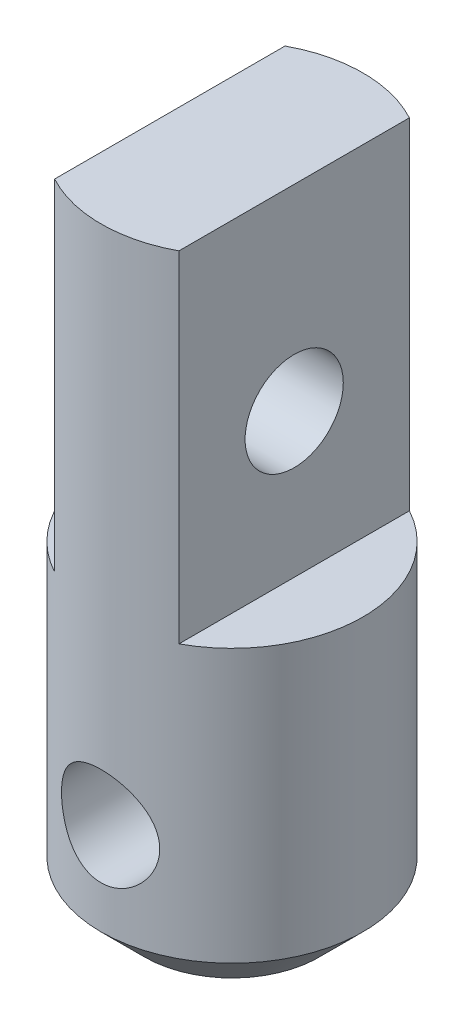
ISO-10303-21;
HEADER;
FILE_DESCRIPTION(('STEP AP214'),'2;1');
FILE_NAME('part.step','',(''),(''),'','','');
FILE_SCHEMA(('AUTOMOTIVE_DESIGN { 1 0 10303 214 1 1 1 1 }'));
ENDSEC;
DATA;
#1=APPLICATION_CONTEXT('core data for automotive mechanical design processes');
#2=APPLICATION_PROTOCOL_DEFINITION('international standard','automotive_design',2000,#1);
#3=PRODUCT_CONTEXT('',#1,'mechanical');
#4=PRODUCT('Part','Part','',(#3));
#5=PRODUCT_RELATED_PRODUCT_CATEGORY('part','',(#4));
#6=PRODUCT_DEFINITION_FORMATION('','',#4);
#7=PRODUCT_DEFINITION_CONTEXT('part definition',#1,'design');
#8=PRODUCT_DEFINITION('design','',#6,#7);
#9=PRODUCT_DEFINITION_SHAPE('','',#8);
#10=(LENGTH_UNIT() NAMED_UNIT(*) SI_UNIT(.MILLI.,.METRE.));
#11=(NAMED_UNIT(*) PLANE_ANGLE_UNIT() SI_UNIT($,.RADIAN.));
#12=(NAMED_UNIT(*) SI_UNIT($,.STERADIAN.) SOLID_ANGLE_UNIT());
#13=UNCERTAINTY_MEASURE_WITH_UNIT(LENGTH_MEASURE(1.E-05),#10,'distance_accuracy_value','');
#14=(GEOMETRIC_REPRESENTATION_CONTEXT(3) GLOBAL_UNCERTAINTY_ASSIGNED_CONTEXT((#13)) GLOBAL_UNIT_ASSIGNED_CONTEXT((#10,
#11,#12)) REPRESENTATION_CONTEXT('',''));
#15=CARTESIAN_POINT('',(0.,0.,0.));
#16=DIRECTION('',(0.,0.,1.));
#17=DIRECTION('',(1.,0.,0.));
#18=AXIS2_PLACEMENT_3D('',#15,#16,#17);
#19=CARTESIAN_POINT('',(0.,14.5,0.));
#20=DIRECTION('',(0.,1.,0.));
#21=DIRECTION('',(0.,0.,1.));
#22=AXIS2_PLACEMENT_3D('',#19,#20,#21);
#23=PLANE('',#22);
#24=CARTESIAN_POINT('',(0.,14.5,0.));
#25=DIRECTION('',(0.,1.,0.));
#26=DIRECTION('',(0.,0.,1.));
#27=AXIS2_PLACEMENT_3D('',#24,#25,#26);
#28=CIRCLE('',#27,6.);
#29=CARTESIAN_POINT('',(2.85,14.5,5.27991477203941));
#30=VERTEX_POINT('',#29);
#31=CARTESIAN_POINT('',(2.85,14.5,-5.27991477203941));
#32=VERTEX_POINT('',#31);
#33=EDGE_CURVE('E149',#30,#32,#28,.T.);
#34=ORIENTED_EDGE('',*,*,#33,.T.);
#35=DIRECTION('',(0.,0.,1.));
#36=VECTOR('',#35,1.);
#37=CARTESIAN_POINT('',(2.85,14.5,-5.27991477203941));
#38=LINE('',#37,#36);
#39=EDGE_CURVE('E116',#32,#30,#38,.T.);
#40=ORIENTED_EDGE('',*,*,#39,.T.);
#41=EDGE_LOOP('',(#34,#40));
#42=FACE_BOUND('',#41,.T.);
#43=ADVANCED_FACE('F59',(#42),#23,.T.);
#44=CARTESIAN_POINT('',(0.,14.5,0.));
#45=DIRECTION('',(0.,-1.,0.));
#46=DIRECTION('',(0.,0.,-1.));
#47=AXIS2_PLACEMENT_3D('',#44,#45,#46);
#48=CYLINDRICAL_SURFACE('',#47,6.);
#49=CARTESIAN_POINT('',(0.,8.44999999999999,-6.));
#50=CARTESIAN_POINT('',(-0.121852588406779,8.45000435345466,-6.00000326184227));
#51=CARTESIAN_POINT('',(-0.243675362672687,8.44007035962742,-5.99625568924776));
#52=CARTESIAN_POINT('',(-0.48368017852854,8.4007577070951,-5.98168044010391));
#53=CARTESIAN_POINT('',(-0.601862741981422,8.37138184929414,-5.9708537834099));
#54=CARTESIAN_POINT('',(-0.831091177486316,8.29437049734235,-5.94328248587317));
#55=CARTESIAN_POINT('',(-0.942150336243413,8.24677022476731,-5.9265492652416));
#56=CARTESIAN_POINT('',(-1.15469896524038,8.13484038047626,-5.8888315164803));
#57=CARTESIAN_POINT('',(-1.25618585876681,8.07050632168376,-5.86784584841322));
#58=CARTESIAN_POINT('',(-1.45101962556873,7.92408120339363,-5.82279370456825));
#59=CARTESIAN_POINT('',(-1.54390609522678,7.84140460661089,-5.79864003875349));
#60=CARTESIAN_POINT('',(-1.71486632211544,7.66188434801173,-5.7504033130699));
#61=CARTESIAN_POINT('',(-1.79293554538803,7.56503636586818,-5.72632027702549));
#62=CARTESIAN_POINT('',(-1.93497303323977,7.35542379871518,-5.67993705926597));
#63=CARTESIAN_POINT('',(-1.99829089793639,7.24219345018127,-5.65773973231228));
#64=CARTESIAN_POINT('',(-2.10477969501126,7.00572746874721,-5.6189979035615));
#65=CARTESIAN_POINT('',(-2.14795867441858,6.88249585526734,-5.60245114463822));
#66=CARTESIAN_POINT('',(-2.21112646526323,6.6348248896127,-5.57781619236204));
#67=CARTESIAN_POINT('',(-2.23199389827836,6.51064244234684,-5.56940886526257));
#68=CARTESIAN_POINT('',(-2.25269334797471,6.26027576300924,-5.56107092191822));
#69=CARTESIAN_POINT('',(-2.25253405203945,6.13409237918829,-5.56113680488957));
#70=CARTESIAN_POINT('',(-2.23185644415026,5.89134571218056,-5.56946267448082));
#71=CARTESIAN_POINT('',(-2.21255712763505,5.77465864093373,-5.57723203306683));
#72=CARTESIAN_POINT('',(-2.15616251802494,5.54631927439203,-5.59927407089295));
#73=CARTESIAN_POINT('',(-2.11906454494887,5.43466774007918,-5.61354772948295));
#74=CARTESIAN_POINT('',(-2.02745622857855,5.21708439840765,-5.6472855328538));
#75=CARTESIAN_POINT('',(-1.9726297310565,5.11130077081805,-5.66684276982249));
#76=CARTESIAN_POINT('',(-1.84734110644046,4.91008139361354,-5.70891315208979));
#77=CARTESIAN_POINT('',(-1.77687358093344,4.81464923372045,-5.73142731685737));
#78=CARTESIAN_POINT('',(-1.61672671149823,4.63009450452369,-5.7787205828867));
#79=CARTESIAN_POINT('',(-1.52607448075433,4.54182703887786,-5.80355021183506));
#80=CARTESIAN_POINT('',(-1.33096888622853,4.38149305069131,-5.85137592246129));
#81=CARTESIAN_POINT('',(-1.22651340524604,4.3094290180915,-5.87437172198928));
#82=CARTESIAN_POINT('',(-1.00458515548863,4.18260440440622,-5.9163959221362));
#83=CARTESIAN_POINT('',(-0.886936070767076,4.12812862816841,-5.93535747389424));
#84=CARTESIAN_POINT('',(-0.643255275786872,4.04002609359495,-5.96668077490443));
#85=CARTESIAN_POINT('',(-0.517227316268649,4.00639007515833,-5.9790454551224));
#86=CARTESIAN_POINT('',(-0.267562864722997,3.9625658186871,-5.99526664842098));
#87=CARTESIAN_POINT('',(-0.144155429343313,3.95122609042624,-5.99954053538529));
#88=CARTESIAN_POINT('',(0.102858712882537,3.94896340415013,-6.00038840550189));
#89=CARTESIAN_POINT('',(0.226465369475059,3.95803591952484,-5.99696409580295));
#90=CARTESIAN_POINT('',(0.465393072842788,3.99546506346301,-5.98307564658965));
#91=CARTESIAN_POINT('',(0.580849992011003,4.02306731560563,-5.97288706443457));
#92=CARTESIAN_POINT('',(0.80541263243583,4.09577910882099,-5.94677215637576));
#93=CARTESIAN_POINT('',(0.9145175255213,4.14089092692206,-5.93084508423045));
#94=CARTESIAN_POINT('',(1.12687164766523,4.24877961865922,-5.89424436611522));
#95=CARTESIAN_POINT('',(1.22985462533669,4.31203659383508,-5.87344500314022));
#96=CARTESIAN_POINT('',(1.42408906758993,4.45387715475734,-5.82940007346996));
#97=CARTESIAN_POINT('',(1.51533618040567,4.53246639881773,-5.80615360514274));
#98=CARTESIAN_POINT('',(1.68904619811681,4.70810618318642,-5.75809994236484));
#99=CARTESIAN_POINT('',(1.77069231185352,4.80596327415905,-5.73328044755594));
#100=CARTESIAN_POINT('',(1.91656575047854,5.01447707706149,-5.68618223620281));
#101=CARTESIAN_POINT('',(1.98079151121777,5.12513493708275,-5.66390374791599));
#102=CARTESIAN_POINT('',(2.09006660278496,5.35702398015847,-5.62450244733695));
#103=CARTESIAN_POINT('',(2.13503528170376,5.47829711886566,-5.6074014049274));
#104=CARTESIAN_POINT('',(2.20361825200333,5.72751464553173,-5.58081049336508));
#105=CARTESIAN_POINT('',(2.22724575458302,5.85545485429719,-5.57131591586236));
#106=CARTESIAN_POINT('',(2.25129520646758,6.10552423931167,-5.5616384218886));
#107=CARTESIAN_POINT('',(2.25310997243755,6.22749894757533,-5.56089666785012));
#108=CARTESIAN_POINT('',(2.23705073462388,6.46991797441425,-5.56737619117939));
#109=CARTESIAN_POINT('',(2.21917859775185,6.59036243700738,-5.57459671348349));
#110=CARTESIAN_POINT('',(2.16533723445362,6.82257084007483,-5.59572212378149));
#111=CARTESIAN_POINT('',(2.12993697474785,6.93448751936802,-5.60941628064995));
#112=CARTESIAN_POINT('',(2.04254545169879,7.15085826274163,-5.64182322446767));
#113=CARTESIAN_POINT('',(1.99054999417416,7.25531043210521,-5.66053727992822));
#114=CARTESIAN_POINT('',(1.8682811390723,7.45974018454644,-5.70209585855947));
#115=CARTESIAN_POINT('',(1.79719249204515,7.55919619519986,-5.72510547661446));
#116=CARTESIAN_POINT('',(1.64001728594858,7.7452123414568,-5.77209370135766));
#117=CARTESIAN_POINT('',(1.55392596019212,7.83176836218013,-5.79607261414718));
#118=CARTESIAN_POINT('',(1.36362059517693,7.99430293373276,-5.84385636914822));
#119=CARTESIAN_POINT('',(1.25867796631948,8.069455630152,-5.86758157350967));
#120=CARTESIAN_POINT('',(1.03681983480122,8.20103398291483,-5.91081771685546));
#121=CARTESIAN_POINT('',(0.919903401135926,8.25745818160455,-5.93032832777339));
#122=CARTESIAN_POINT('',(0.671998623003464,8.35156524357249,-5.9636143891002));
#123=CARTESIAN_POINT('',(0.540620133351309,8.38833059690284,-5.97710485737534));
#124=CARTESIAN_POINT('',(0.272813600409571,8.43753943988101,-5.9952936326938));
#125=CARTESIAN_POINT('',(0.136388124547287,8.44999512723098,-5.99999634905951));
#126=CARTESIAN_POINT('',(0.,8.44999999999999,-6.));
#127=B_SPLINE_CURVE_WITH_KNOTS('',3,(#49,#50,#51,#52,#53,#54,#55,#56,#57,#58,#59,#60,#61,#62,
#63,#64,#65,#66,#67,#68,#69,#70,#71,#72,#73,#74,#75,#76,#77,#78,#79,#80,#81,#82,#83,#84,#85,#86,
#87,#88,#89,#90,#91,#92,#93,#94,#95,#96,#97,#98,#99,#100,#101,#102,#103,#104,#105,#106,#107,
#108,#109,#110,#111,#112,#113,#114,#115,#116,#117,#118,#119,#120,#121,#122,#123,#124,#125,#126),
.UNSPECIFIED.,.T.,.F.,(4,2,2,2,2,2,2,2,2,2,2,2,2,2,2,2,2,2,2,2,2,2,2,2,2,2,2,2,2,2,2,2,2,2,2,2,
2,2,4),(0.,0.365054702340838,0.730056824295688,1.09435705382036,1.45875506941423,
1.83710427874073,2.21556907388432,2.60845011752487,3.001174040282,3.37778811625351,
3.7542465911956,4.10817517679955,4.46215707090882,4.82283612580526,5.18363986116386,
5.56869230003717,5.95380386857597,6.34487062929111,6.73576349548267,7.10587529453886,
7.47590502585779,7.83171656885758,8.18757439881678,8.55388832789397,8.92033770029799,
9.30804779183484,9.69579268380208,10.085146000908,10.4742581243476,10.8383814522038,
11.2024702531688,11.555447136398,11.9085132998476,12.280087078264,12.6517791299559,
13.0435849448105,13.4354212470765,13.8442277254806,14.2528290269419),.UNSPECIFIED.);
#128=CARTESIAN_POINT('',(0.,8.44999999999999,-6.));
#129=VERTEX_POINT('',#128);
#130=EDGE_CURVE('E13',#129,#129,#127,.T.);
#131=ORIENTED_EDGE('',*,*,#130,.T.);
#132=EDGE_LOOP('',(#131));
#133=FACE_BOUND('',#132,.T.);
#134=CARTESIAN_POINT('',(2.24999999999999,6.2,5.56214886532175));
#135=CARTESIAN_POINT('',(2.25000456158465,6.07848877438745,5.5621446091142));
#136=CARTESIAN_POINT('',(2.24012396321522,5.95700761615536,5.56617390222235));
#137=CARTESIAN_POINT('',(2.20104281840611,5.71770787554859,5.58174238819325));
#138=CARTESIAN_POINT('',(2.17184285059448,5.59988918359124,5.59328135613603));
#139=CARTESIAN_POINT('',(2.09534486416722,5.37143694260838,5.62238220458169));
#140=CARTESIAN_POINT('',(2.04809020899753,5.26078691503107,5.63992964363772));
#141=CARTESIAN_POINT('',(1.93697785113814,5.04894215476405,5.67904701300013));
#142=CARTESIAN_POINT('',(1.87311516142494,4.94775027457412,5.70061815098282));
#143=CARTESIAN_POINT('',(1.72719992061309,4.75266453256798,5.74655362001394));
#144=CARTESIAN_POINT('',(1.64445571819977,4.6593072055565,5.77100012886163));
#145=CARTESIAN_POINT('',(1.46459375966821,4.48741577799218,5.81924625942062));
#146=CARTESIAN_POINT('',(1.36747294538497,4.40888483938706,5.84304574221971));
#147=CARTESIAN_POINT('',(1.15754198276645,4.26629073155675,5.88829310905043));
#148=CARTESIAN_POINT('',(1.04431042130705,4.20281078792626,5.90963341835315));
#149=CARTESIAN_POINT('',(0.807833657947854,4.09602324121259,5.94657011960715));
#150=CARTESIAN_POINT('',(0.684591946400297,4.05270864201203,5.96216850325496));
#151=CARTESIAN_POINT('',(0.43723401251525,3.98936315633809,5.98528045655173));
#152=CARTESIAN_POINT('',(0.313384795922396,3.96840855883932,5.99311372822162));
#153=CARTESIAN_POINT('',(0.0636965456921745,3.94741819858253,6.0009602116191));
#154=CARTESIAN_POINT('',(-0.0621418275942603,3.94737563357196,6.00097596622365));
#155=CARTESIAN_POINT('',(-0.305615314596704,3.96767264219775,5.9933889885583));
#156=CARTESIAN_POINT('',(-0.423348267400316,3.98700394692318,5.9861631299498));
#157=CARTESIAN_POINT('',(-0.65375882697662,4.04380387283839,5.96539912398439));
#158=CARTESIAN_POINT('',(-0.766436075145573,4.08127377839327,5.95186052963534));
#159=CARTESIAN_POINT('',(-0.985483525954526,4.17375567751357,5.91956653751126));
#160=CARTESIAN_POINT('',(-1.09173808843048,4.22901500790185,5.90073809204478));
#161=CARTESIAN_POINT('',(-1.29372991193682,4.35528814539486,5.85976965338557));
#162=CARTESIAN_POINT('',(-1.38946376540028,4.42630703452928,5.83762859271644));
#163=CARTESIAN_POINT('',(-1.57363573019949,4.58694092942174,5.79078794481202));
#164=CARTESIAN_POINT('',(-1.6613192178879,4.67740087346399,5.76601445636153));
#165=CARTESIAN_POINT('',(-1.82055593354745,4.87188948999401,5.71773690978256));
#166=CARTESIAN_POINT('',(-1.89210511042086,4.97592155992358,5.69423317159445));
#167=CARTESIAN_POINT('',(-2.01848417709906,5.19757920115803,5.65069055213362));
#168=CARTESIAN_POINT('',(-2.07290771768007,5.3154552403786,5.63074015585677));
#169=CARTESIAN_POINT('',(-2.16084696652385,5.55964433759583,5.59758657804233));
#170=CARTESIAN_POINT('',(-2.19437430905774,5.68595265734428,5.58437964272365));
#171=CARTESIAN_POINT('',(-2.23785287566783,5.93596394350662,5.56709395868656));
#172=CARTESIAN_POINT('',(-2.24900281739058,6.05942615831296,5.56255177871503));
#173=CARTESIAN_POINT('',(-2.25086828453797,6.30651403510387,5.56179809278329));
#174=CARTESIAN_POINT('',(-2.24158891640482,6.43013964852642,5.56558450503572));
#175=CARTESIAN_POINT('',(-2.20394600280387,6.6678948834337,5.58059072446897));
#176=CARTESIAN_POINT('',(-2.17650927501377,6.78219670364758,5.59144914325289));
#177=CARTESIAN_POINT('',(-2.10449661960915,7.0045219170797,5.61894730568927));
#178=CARTESIAN_POINT('',(-2.05991718051922,7.11254401875204,5.63558823375091));
#179=CARTESIAN_POINT('',(-1.95300438412928,7.32374665711447,5.67354364674294));
#180=CARTESIAN_POINT('',(-1.89006817765573,7.42659393820605,5.69500993338145));
#181=CARTESIAN_POINT('',(-1.74886976793715,7.62069347258901,5.7399422144139));
#182=CARTESIAN_POINT('',(-1.6706019554465,7.71194146193693,5.76340893891103));
#183=CARTESIAN_POINT('',(-1.49509101135141,7.88625255979266,5.8114956982979));
#184=CARTESIAN_POINT('',(-1.39695951223659,7.96843011315313,5.83609454035545));
#185=CARTESIAN_POINT('',(-1.18769620762972,8.11525755138415,5.8822481244495));
#186=CARTESIAN_POINT('',(-1.076564359984,8.17990737941875,5.90380285661496));
#187=CARTESIAN_POINT('',(-0.844524494202711,8.28941908429941,5.94142478556829));
#188=CARTESIAN_POINT('',(-0.723651649596936,8.3343486856889,5.95751072007015));
#189=CARTESIAN_POINT('',(-0.475322831284879,8.40298462077487,5.98244155068857));
#190=CARTESIAN_POINT('',(-0.347869981085387,8.42670092813359,5.99128984949119));
#191=CARTESIAN_POINT('',(-0.0980033779107223,8.45116160413223,6.0004261097561));
#192=CARTESIAN_POINT('',(0.0242711520912683,8.45316422458848,6.00118291430646));
#193=CARTESIAN_POINT('',(0.267340179618636,8.4373772608319,5.99527334713836));
#194=CARTESIAN_POINT('',(0.388134853867886,8.41959006367121,5.98860787069696));
#195=CARTESIAN_POINT('',(0.621822372565688,8.36561172275956,5.96881634405656));
#196=CARTESIAN_POINT('',(0.73483609660325,8.32988014118246,5.95585187067023));
#197=CARTESIAN_POINT('',(0.953273209509583,8.24148497992345,5.92481675431488));
#198=CARTESIAN_POINT('',(1.05869515691331,8.18881819504287,5.90674514483509));
#199=CARTESIAN_POINT('',(1.26381026549161,8.06552908474277,5.86635927450098));
#200=CARTESIAN_POINT('',(1.36307632327026,7.99424503922875,5.8438986016319));
#201=CARTESIAN_POINT('',(1.54862602128505,7.83678825471861,5.79749261542319));
#202=CARTESIAN_POINT('',(1.63490500688388,7.75061020128827,5.77354677411238));
#203=CARTESIAN_POINT('',(1.79671821354289,7.56040380253231,5.72532194608556));
#204=CARTESIAN_POINT('',(1.87144499724023,7.45567339676818,5.70109208022947));
#205=CARTESIAN_POINT('',(2.00227064335278,7.23437619564035,5.65647487506251));
#206=CARTESIAN_POINT('',(2.05836757317287,7.11780817392106,5.6360879344979));
#207=CARTESIAN_POINT('',(2.15198830461335,6.87056647853554,5.60103404776805));
#208=CARTESIAN_POINT('',(2.18859004349074,6.73949845022719,5.58665704924503));
#209=CARTESIAN_POINT('',(2.23758535083327,6.47227209207145,5.56721991516253));
#210=CARTESIAN_POINT('',(2.24999489010137,6.33611718095418,5.56215363313617));
#211=CARTESIAN_POINT('',(2.24999999999999,6.2,5.56214886532175));
#212=B_SPLINE_CURVE_WITH_KNOTS('',3,(#134,#135,#136,#137,#138,#139,#140,#141,#142,#143,#144,
#145,#146,#147,#148,#149,#150,#151,#152,#153,#154,#155,#156,#157,#158,#159,#160,#161,#162,#163,
#164,#165,#166,#167,#168,#169,#170,#171,#172,#173,#174,#175,#176,#177,#178,#179,#180,#181,#182,
#183,#184,#185,#186,#187,#188,#189,#190,#191,#192,#193,#194,#195,#196,#197,#198,#199,#200,#201,
#202,#203,#204,#205,#206,#207,#208,#209,#210,#211),.UNSPECIFIED.,.T.,.F.,(4,2,2,2,2,2,2,2,2,2,2,
2,2,2,2,2,2,2,2,2,2,2,2,2,2,2,2,2,2,2,2,2,2,2,2,2,2,2,4),(0.,0.364026812166973,0.72804272198075,
1.09118978521801,1.45444601960687,1.83411978609938,2.21387443242721,2.60655108212878,
2.99909139580241,3.37470027742765,3.75018698115532,4.10709709213037,4.46403247903249,
4.82616196824247,5.18840840451709,5.57185012607057,5.95538801749247,6.34743888390623,
6.7392712746794,7.10948486625456,7.47960593098055,7.83215768907026,8.18478170159017,
8.5506234152346,8.9165992271426,9.30577525505164,9.69495254489994,10.0827826334998,
10.4704302835492,10.8354858083963,11.2004973049395,11.5566041102056,11.9127783528397,
12.2839248553021,12.6552040635717,13.0460789932784,13.4369944583109,13.8450476832112,
14.2528314349931),.UNSPECIFIED.);
#213=CARTESIAN_POINT('',(2.24999999999999,6.2,5.56214886532175));
#214=VERTEX_POINT('',#213);
#215=EDGE_CURVE('E73',#214,#214,#212,.T.);
#216=ORIENTED_EDGE('',*,*,#215,.T.);
#217=EDGE_LOOP('',(#216));
#218=FACE_BOUND('',#217,.T.);
#219=CARTESIAN_POINT('',(0.,2.00000000000001,0.));
#220=DIRECTION('',(0.,1.,0.));
#221=DIRECTION('',(0.,0.,1.));
#222=AXIS2_PLACEMENT_3D('',#219,#220,#221);
#223=CIRCLE('',#222,6.);
#224=CARTESIAN_POINT('',(0.,2.00000000000001,6.));
#225=VERTEX_POINT('',#224);
#226=EDGE_CURVE('E152',#225,#225,#223,.T.);
#227=ORIENTED_EDGE('',*,*,#226,.T.);
#228=EDGE_LOOP('',(#227));
#229=FACE_BOUND('',#228,.T.);
#230=ORIENTED_EDGE('',*,*,#33,.F.);
#231=DIRECTION('',(0.,-1.,0.));
#232=VECTOR('',#231,1.);
#233=CARTESIAN_POINT('',(2.85,30.1,5.27991477203941));
#234=LINE('',#233,#232);
#235=CARTESIAN_POINT('',(2.85,30.1,5.27991477203941));
#236=VERTEX_POINT('',#235);
#237=EDGE_CURVE('E80',#236,#30,#234,.T.);
#238=ORIENTED_EDGE('',*,*,#237,.F.);
#239=CARTESIAN_POINT('',(0.,30.1,0.));
#240=DIRECTION('',(0.,1.,0.));
#241=DIRECTION('',(0.,0.,1.));
#242=AXIS2_PLACEMENT_3D('',#239,#240,#241);
#243=CIRCLE('',#242,6.);
#244=CARTESIAN_POINT('',(-2.85,30.1,5.27991477203941));
#245=VERTEX_POINT('',#244);
#246=EDGE_CURVE('E129',#245,#236,#243,.T.);
#247=ORIENTED_EDGE('',*,*,#246,.F.);
#248=DIRECTION('',(0.,-1.,0.));
#249=VECTOR('',#248,1.);
#250=CARTESIAN_POINT('',(-2.85,30.1,5.27991477203941));
#251=LINE('',#250,#249);
#252=CARTESIAN_POINT('',(-2.85,14.5,5.27991477203941));
#253=VERTEX_POINT('',#252);
#254=EDGE_CURVE('E141',#245,#253,#251,.T.);
#255=ORIENTED_EDGE('',*,*,#254,.T.);
#256=CARTESIAN_POINT('',(-2.85,14.5,-5.27991477203941));
#257=VERTEX_POINT('',#256);
#258=EDGE_CURVE('E144',#257,#253,#28,.T.);
#259=ORIENTED_EDGE('',*,*,#258,.F.);
#260=DIRECTION('',(0.,-1.,0.));
#261=VECTOR('',#260,1.);
#262=CARTESIAN_POINT('',(-2.85,30.1,-5.27991477203941));
#263=LINE('',#262,#261);
#264=CARTESIAN_POINT('',(-2.85,30.1,-5.27991477203941));
#265=VERTEX_POINT('',#264);
#266=EDGE_CURVE('E121',#265,#257,#263,.T.);
#267=ORIENTED_EDGE('',*,*,#266,.F.);
#268=CARTESIAN_POINT('',(0.,30.1,0.));
#269=DIRECTION('',(0.,1.,0.));
#270=DIRECTION('',(0.,0.,1.));
#271=AXIS2_PLACEMENT_3D('',#268,#269,#270);
#272=CIRCLE('',#271,6.);
#273=CARTESIAN_POINT('',(2.85,30.1,-5.27991477203941));
#274=VERTEX_POINT('',#273);
#275=EDGE_CURVE('E110',#274,#265,#272,.T.);
#276=ORIENTED_EDGE('',*,*,#275,.F.);
#277=DIRECTION('',(0.,-1.,0.));
#278=VECTOR('',#277,1.);
#279=CARTESIAN_POINT('',(2.85,30.1,-5.27991477203941));
#280=LINE('',#279,#278);
#281=EDGE_CURVE('E113',#274,#32,#280,.T.);
#282=ORIENTED_EDGE('',*,*,#281,.T.);
#283=EDGE_LOOP('',(#230,#238,#247,#255,#259,#267,#276,#282));
#284=FACE_BOUND('',#283,.T.);
#285=ADVANCED_FACE('F123',(#133,#218,#229,#284),#48,.T.);
#286=DIRECTION('',(0.,0.,1.));
#287=VECTOR('',#286,1.);
#288=CARTESIAN_POINT('',(-2.85,14.5,0.));
#289=LINE('',#288,#287);
#290=EDGE_CURVE('E105',#257,#253,#289,.T.);
#291=ORIENTED_EDGE('',*,*,#290,.F.);
#292=ORIENTED_EDGE('',*,*,#258,.T.);
#293=EDGE_LOOP('',(#291,#292));
#294=FACE_BOUND('',#293,.T.);
#295=ADVANCED_FACE('F183',(#294),#23,.T.);
#296=CARTESIAN_POINT('',(0.,0.,0.));
#297=DIRECTION('',(0.,1.,0.));
#298=DIRECTION('',(0.,0.,1.));
#299=AXIS2_PLACEMENT_3D('',#296,#297,#298);
#300=PLANE('',#299);
#301=CARTESIAN_POINT('',(0.,0.,0.));
#302=DIRECTION('',(0.,1.,0.));
#303=DIRECTION('',(0.,0.,1.));
#304=AXIS2_PLACEMENT_3D('',#301,#302,#303);
#305=CIRCLE('',#304,3.99999999999998);
#306=CARTESIAN_POINT('',(0.,0.,3.99999999999998));
#307=VERTEX_POINT('',#306);
#308=EDGE_CURVE('E156',#307,#307,#305,.F.);
#309=ORIENTED_EDGE('',*,*,#308,.T.);
#310=EDGE_LOOP('',(#309));
#311=FACE_BOUND('',#310,.T.);
#312=ADVANCED_FACE('F185',(#311),#300,.F.);
#313=CARTESIAN_POINT('',(0.,2.00000000000001,0.));
#314=DIRECTION('',(0.,1.,0.));
#315=DIRECTION('',(0.,0.,1.));
#316=AXIS2_PLACEMENT_3D('',#313,#314,#315);
#317=CONICAL_SURFACE('',#316,6.,0.78539816339745);
#318=ORIENTED_EDGE('',*,*,#308,.F.);
#319=EDGE_LOOP('',(#318));
#320=FACE_BOUND('',#319,.T.);
#321=ORIENTED_EDGE('',*,*,#226,.F.);
#322=EDGE_LOOP('',(#321));
#323=FACE_BOUND('',#322,.T.);
#324=ADVANCED_FACE('F62',(#320,#323),#317,.T.);
#325=CARTESIAN_POINT('',(-2.85,30.1,0.));
#326=DIRECTION('',(1.,0.,0.));
#327=DIRECTION('',(0.,0.,-1.));
#328=AXIS2_PLACEMENT_3D('',#325,#326,#327);
#329=PLANE('',#328);
#330=CARTESIAN_POINT('',(-2.85,21.1,0.));
#331=DIRECTION('',(1.,0.,0.));
#332=DIRECTION('',(0.,0.,-1.));
#333=AXIS2_PLACEMENT_3D('',#330,#331,#332);
#334=CIRCLE('',#333,2.24999999999999);
#335=CARTESIAN_POINT('',(-2.85,21.1,-2.24999999999999));
#336=VERTEX_POINT('',#335);
#337=EDGE_CURVE('E138',#336,#336,#334,.T.);
#338=ORIENTED_EDGE('',*,*,#337,.T.);
#339=EDGE_LOOP('',(#338));
#340=FACE_BOUND('',#339,.T.);
#341=ORIENTED_EDGE('',*,*,#290,.T.);
#342=ORIENTED_EDGE('',*,*,#254,.F.);
#343=DIRECTION('',(0.,0.,-1.));
#344=VECTOR('',#343,1.);
#345=CARTESIAN_POINT('',(-2.85,30.1,0.));
#346=LINE('',#345,#344);
#347=EDGE_CURVE('E89',#245,#265,#346,.T.);
#348=ORIENTED_EDGE('',*,*,#347,.T.);
#349=ORIENTED_EDGE('',*,*,#266,.T.);
#350=EDGE_LOOP('',(#341,#342,#348,#349));
#351=FACE_BOUND('',#350,.T.);
#352=ADVANCED_FACE('F176',(#340,#351),#329,.F.);
#353=CARTESIAN_POINT('',(2.85,30.1,-5.27991477203941));
#354=DIRECTION('',(1.,0.,0.));
#355=DIRECTION('',(0.,0.,-1.));
#356=AXIS2_PLACEMENT_3D('',#353,#354,#355);
#357=PLANE('',#356);
#358=CARTESIAN_POINT('',(2.85,21.1,0.));
#359=DIRECTION('',(1.,0.,0.));
#360=DIRECTION('',(0.,0.,-1.));
#361=AXIS2_PLACEMENT_3D('',#358,#359,#360);
#362=CIRCLE('',#361,2.24999999999999);
#363=CARTESIAN_POINT('',(2.85,21.1,-2.24999999999999));
#364=VERTEX_POINT('',#363);
#365=EDGE_CURVE('E206',#364,#364,#362,.T.);
#366=ORIENTED_EDGE('',*,*,#365,.F.);
#367=EDGE_LOOP('',(#366));
#368=FACE_BOUND('',#367,.T.);
#369=ORIENTED_EDGE('',*,*,#39,.F.);
#370=ORIENTED_EDGE('',*,*,#281,.F.);
#371=DIRECTION('',(0.,0.,1.));
#372=VECTOR('',#371,1.);
#373=CARTESIAN_POINT('',(2.85,30.1,-5.27991477203941));
#374=LINE('',#373,#372);
#375=EDGE_CURVE('E115',#274,#236,#374,.T.);
#376=ORIENTED_EDGE('',*,*,#375,.T.);
#377=ORIENTED_EDGE('',*,*,#237,.T.);
#378=EDGE_LOOP('',(#369,#370,#376,#377));
#379=FACE_BOUND('',#378,.T.);
#380=ADVANCED_FACE('F114',(#368,#379),#357,.T.);
#381=CARTESIAN_POINT('',(0.,30.1,0.));
#382=DIRECTION('',(0.,1.,0.));
#383=DIRECTION('',(0.,0.,1.));
#384=AXIS2_PLACEMENT_3D('',#381,#382,#383);
#385=PLANE('',#384);
#386=ORIENTED_EDGE('',*,*,#347,.F.);
#387=ORIENTED_EDGE('',*,*,#246,.T.);
#388=ORIENTED_EDGE('',*,*,#375,.F.);
#389=ORIENTED_EDGE('',*,*,#275,.T.);
#390=EDGE_LOOP('',(#386,#387,#388,#389));
#391=FACE_BOUND('',#390,.T.);
#392=ADVANCED_FACE('F127',(#391),#385,.T.);
#393=CARTESIAN_POINT('',(0.,6.2,6.));
#394=DIRECTION('',(0.,0.,1.));
#395=DIRECTION('',(1.,0.,0.));
#396=AXIS2_PLACEMENT_3D('',#393,#394,#395);
#397=CYLINDRICAL_SURFACE('',#396,2.24999999999999);
#398=ORIENTED_EDGE('',*,*,#215,.F.);
#399=EDGE_LOOP('',(#398));
#400=FACE_BOUND('',#399,.T.);
#401=ORIENTED_EDGE('',*,*,#130,.F.);
#402=EDGE_LOOP('',(#401));
#403=FACE_BOUND('',#402,.T.);
#404=ADVANCED_FACE('F166',(#400,#403),#397,.F.);
#405=CARTESIAN_POINT('',(2.85,21.1,0.));
#406=DIRECTION('',(1.,0.,0.));
#407=DIRECTION('',(0.,0.,-1.));
#408=AXIS2_PLACEMENT_3D('',#405,#406,#407);
#409=CYLINDRICAL_SURFACE('',#408,2.24999999999999);
#410=ORIENTED_EDGE('',*,*,#365,.T.);
#411=EDGE_LOOP('',(#410));
#412=FACE_BOUND('',#411,.T.);
#413=ORIENTED_EDGE('',*,*,#337,.F.);
#414=EDGE_LOOP('',(#413));
#415=FACE_BOUND('',#414,.T.);
#416=ADVANCED_FACE('F171',(#412,#415),#409,.F.);
#417=CLOSED_SHELL('',(#43,#285,#295,#312,#324,#352,#380,#392,#404,#416));
#418=MANIFOLD_SOLID_BREP('B2',#417);
#419=ADVANCED_BREP_SHAPE_REPRESENTATION('',(#18,#418),#14);
#420=SHAPE_DEFINITION_REPRESENTATION(#9,#419);
ENDSEC;
END-ISO-10303-21;
